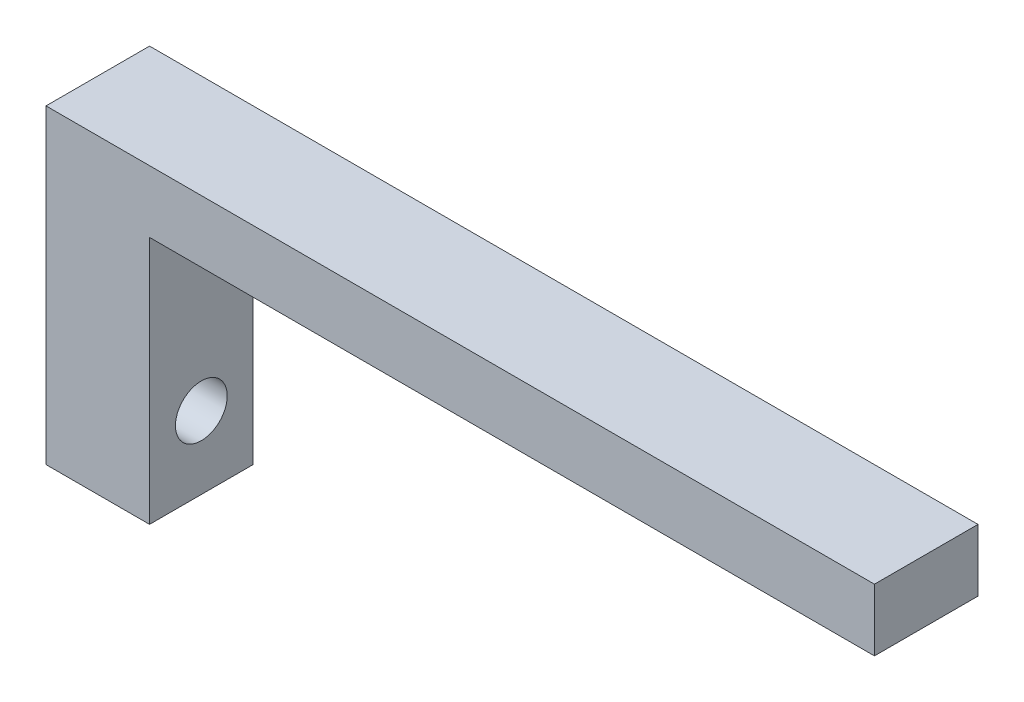
ISO-10303-21;
HEADER;
FILE_DESCRIPTION(('STEP AP214'),'2;1');
FILE_NAME('part.step','',(''),(''),'','','');
FILE_SCHEMA(('AUTOMOTIVE_DESIGN { 1 0 10303 214 1 1 1 1 }'));
ENDSEC;
DATA;
#1=APPLICATION_CONTEXT('core data for automotive mechanical design processes');
#2=APPLICATION_PROTOCOL_DEFINITION('international standard','automotive_design',2000,#1);
#3=PRODUCT_CONTEXT('',#1,'mechanical');
#4=PRODUCT('Part','Part','',(#3));
#5=PRODUCT_RELATED_PRODUCT_CATEGORY('part','',(#4));
#6=PRODUCT_DEFINITION_FORMATION('','',#4);
#7=PRODUCT_DEFINITION_CONTEXT('part definition',#1,'design');
#8=PRODUCT_DEFINITION('design','',#6,#7);
#9=PRODUCT_DEFINITION_SHAPE('','',#8);
#10=(LENGTH_UNIT() NAMED_UNIT(*) SI_UNIT(.MILLI.,.METRE.));
#11=(NAMED_UNIT(*) PLANE_ANGLE_UNIT() SI_UNIT($,.RADIAN.));
#12=(NAMED_UNIT(*) SI_UNIT($,.STERADIAN.) SOLID_ANGLE_UNIT());
#13=UNCERTAINTY_MEASURE_WITH_UNIT(LENGTH_MEASURE(1.E-05),#10,'distance_accuracy_value','');
#14=(GEOMETRIC_REPRESENTATION_CONTEXT(3) GLOBAL_UNCERTAINTY_ASSIGNED_CONTEXT((#13)) GLOBAL_UNIT_ASSIGNED_CONTEXT((#10,
#11,#12)) REPRESENTATION_CONTEXT('',''));
#15=CARTESIAN_POINT('',(0.,0.,0.));
#16=DIRECTION('',(0.,0.,1.));
#17=DIRECTION('',(1.,0.,0.));
#18=AXIS2_PLACEMENT_3D('',#15,#16,#17);
#19=CARTESIAN_POINT('',(40.,4.5,2.5));
#20=DIRECTION('',(-1.,0.,0.));
#21=DIRECTION('',(0.,0.,1.));
#22=AXIS2_PLACEMENT_3D('',#19,#20,#21);
#23=PLANE('',#22);
#24=DIRECTION('',(0.,1.,0.));
#25=VECTOR('',#24,1.);
#26=CARTESIAN_POINT('',(40.,4.5,-2.5));
#27=LINE('',#26,#25);
#28=CARTESIAN_POINT('',(40.,4.5,-2.5));
#29=VERTEX_POINT('',#28);
#30=CARTESIAN_POINT('',(40.,7.5,-2.5));
#31=VERTEX_POINT('',#30);
#32=EDGE_CURVE('E138',#29,#31,#27,.T.);
#33=ORIENTED_EDGE('',*,*,#32,.T.);
#34=DIRECTION('',(0.,0.,-1.));
#35=VECTOR('',#34,1.);
#36=CARTESIAN_POINT('',(40.,7.5,2.5));
#37=LINE('',#36,#35);
#38=CARTESIAN_POINT('',(40.,7.5,2.5));
#39=VERTEX_POINT('',#38);
#40=EDGE_CURVE('E158',#39,#31,#37,.T.);
#41=ORIENTED_EDGE('',*,*,#40,.F.);
#42=DIRECTION('',(0.,1.,0.));
#43=VECTOR('',#42,1.);
#44=CARTESIAN_POINT('',(40.,4.5,2.5));
#45=LINE('',#44,#43);
#46=CARTESIAN_POINT('',(40.,4.5,2.5));
#47=VERTEX_POINT('',#46);
#48=EDGE_CURVE('E150',#47,#39,#45,.T.);
#49=ORIENTED_EDGE('',*,*,#48,.F.);
#50=DIRECTION('',(0.,0.,-1.));
#51=VECTOR('',#50,1.);
#52=CARTESIAN_POINT('',(40.,4.5,2.5));
#53=LINE('',#52,#51);
#54=EDGE_CURVE('E134',#47,#29,#53,.T.);
#55=ORIENTED_EDGE('',*,*,#54,.T.);
#56=EDGE_LOOP('',(#33,#41,#49,#55));
#57=FACE_BOUND('',#56,.T.);
#58=ADVANCED_FACE('F39',(#57),#23,.F.);
#59=CARTESIAN_POINT('',(40.,7.5,2.5));
#60=DIRECTION('',(0.,-1.,0.));
#61=DIRECTION('',(0.,0.,-1.));
#62=AXIS2_PLACEMENT_3D('',#59,#60,#61);
#63=PLANE('',#62);
#64=DIRECTION('',(-1.,0.,0.));
#65=VECTOR('',#64,1.);
#66=CARTESIAN_POINT('',(40.,7.5,-2.5));
#67=LINE('',#66,#65);
#68=CARTESIAN_POINT('',(0.,7.5,-2.5));
#69=VERTEX_POINT('',#68);
#70=EDGE_CURVE('E141',#31,#69,#67,.T.);
#71=ORIENTED_EDGE('',*,*,#70,.T.);
#72=DIRECTION('',(0.,0.,-1.));
#73=VECTOR('',#72,1.);
#74=CARTESIAN_POINT('',(0.,7.5,2.5));
#75=LINE('',#74,#73);
#76=CARTESIAN_POINT('',(0.,7.5,2.5));
#77=VERTEX_POINT('',#76);
#78=EDGE_CURVE('E155',#77,#69,#75,.T.);
#79=ORIENTED_EDGE('',*,*,#78,.F.);
#80=DIRECTION('',(-1.,0.,0.));
#81=VECTOR('',#80,1.);
#82=CARTESIAN_POINT('',(40.,7.5,2.5));
#83=LINE('',#82,#81);
#84=EDGE_CURVE('E97',#39,#77,#83,.T.);
#85=ORIENTED_EDGE('',*,*,#84,.F.);
#86=ORIENTED_EDGE('',*,*,#40,.T.);
#87=EDGE_LOOP('',(#71,#79,#85,#86));
#88=FACE_BOUND('',#87,.T.);
#89=ADVANCED_FACE('F186',(#88),#63,.F.);
#90=CARTESIAN_POINT('',(0.,7.5,2.5));
#91=DIRECTION('',(1.,0.,0.));
#92=DIRECTION('',(0.,1.,0.));
#93=AXIS2_PLACEMENT_3D('',#90,#91,#92);
#94=PLANE('',#93);
#95=CARTESIAN_POINT('',(0.,-4.,0.));
#96=DIRECTION('',(-1.,0.,0.));
#97=DIRECTION('',(0.,0.,1.));
#98=AXIS2_PLACEMENT_3D('',#95,#96,#97);
#99=CIRCLE('',#98,1.24999999999999);
#100=CARTESIAN_POINT('',(0.,-4.,1.24999999999999));
#101=VERTEX_POINT('',#100);
#102=EDGE_CURVE('E229',#101,#101,#99,.T.);
#103=ORIENTED_EDGE('',*,*,#102,.F.);
#104=EDGE_LOOP('',(#103));
#105=FACE_BOUND('',#104,.T.);
#106=CARTESIAN_POINT('',(0.,4.,0.));
#107=DIRECTION('',(-1.,0.,0.));
#108=DIRECTION('',(0.,0.,1.));
#109=AXIS2_PLACEMENT_3D('',#106,#107,#108);
#110=CIRCLE('',#109,1.24999999999999);
#111=CARTESIAN_POINT('',(0.,4.,1.24999999999999));
#112=VERTEX_POINT('',#111);
#113=EDGE_CURVE('E206',#112,#112,#110,.T.);
#114=ORIENTED_EDGE('',*,*,#113,.F.);
#115=EDGE_LOOP('',(#114));
#116=FACE_BOUND('',#115,.T.);
#117=DIRECTION('',(0.,-1.,0.));
#118=VECTOR('',#117,1.);
#119=CARTESIAN_POINT('',(0.,7.5,-2.5));
#120=LINE('',#119,#118);
#121=CARTESIAN_POINT('',(0.,-7.5,-2.5));
#122=VERTEX_POINT('',#121);
#123=EDGE_CURVE('E144',#69,#122,#120,.T.);
#124=ORIENTED_EDGE('',*,*,#123,.T.);
#125=DIRECTION('',(0.,0.,-1.));
#126=VECTOR('',#125,1.);
#127=CARTESIAN_POINT('',(0.,-7.5,2.5));
#128=LINE('',#127,#126);
#129=CARTESIAN_POINT('',(0.,-7.5,2.5));
#130=VERTEX_POINT('',#129);
#131=EDGE_CURVE('E126',#130,#122,#128,.T.);
#132=ORIENTED_EDGE('',*,*,#131,.F.);
#133=DIRECTION('',(0.,-1.,0.));
#134=VECTOR('',#133,1.);
#135=CARTESIAN_POINT('',(0.,7.5,2.5));
#136=LINE('',#135,#134);
#137=EDGE_CURVE('E113',#77,#130,#136,.T.);
#138=ORIENTED_EDGE('',*,*,#137,.F.);
#139=ORIENTED_EDGE('',*,*,#78,.T.);
#140=EDGE_LOOP('',(#124,#132,#138,#139));
#141=FACE_BOUND('',#140,.T.);
#142=ADVANCED_FACE('F184',(#105,#116,#141),#94,.F.);
#143=CARTESIAN_POINT('',(0.,-7.5,2.5));
#144=DIRECTION('',(0.,1.,0.));
#145=DIRECTION('',(0.,0.,1.));
#146=AXIS2_PLACEMENT_3D('',#143,#144,#145);
#147=PLANE('',#146);
#148=DIRECTION('',(1.,0.,0.));
#149=VECTOR('',#148,1.);
#150=CARTESIAN_POINT('',(0.,-7.5,-2.5));
#151=LINE('',#150,#149);
#152=CARTESIAN_POINT('',(5.00000000000001,-7.5,-2.5));
#153=VERTEX_POINT('',#152);
#154=EDGE_CURVE('E122',#122,#153,#151,.T.);
#155=ORIENTED_EDGE('',*,*,#154,.T.);
#156=DIRECTION('',(0.,0.,-1.));
#157=VECTOR('',#156,1.);
#158=CARTESIAN_POINT('',(5.00000000000001,-7.5,2.5));
#159=LINE('',#158,#157);
#160=CARTESIAN_POINT('',(5.00000000000001,-7.5,2.5));
#161=VERTEX_POINT('',#160);
#162=EDGE_CURVE('E119',#161,#153,#159,.T.);
#163=ORIENTED_EDGE('',*,*,#162,.F.);
#164=DIRECTION('',(1.,0.,0.));
#165=VECTOR('',#164,1.);
#166=CARTESIAN_POINT('',(0.,-7.5,2.5));
#167=LINE('',#166,#165);
#168=EDGE_CURVE('E106',#130,#161,#167,.T.);
#169=ORIENTED_EDGE('',*,*,#168,.F.);
#170=ORIENTED_EDGE('',*,*,#131,.T.);
#171=EDGE_LOOP('',(#155,#163,#169,#170));
#172=FACE_BOUND('',#171,.T.);
#173=ADVANCED_FACE('F120',(#172),#147,.F.);
#174=CARTESIAN_POINT('',(5.00000000000001,-7.5,2.5));
#175=DIRECTION('',(-1.,0.,0.));
#176=DIRECTION('',(0.,-1.,0.));
#177=AXIS2_PLACEMENT_3D('',#174,#175,#176);
#178=PLANE('',#177);
#179=CARTESIAN_POINT('',(5.00000000000001,-4.,0.));
#180=DIRECTION('',(-1.,0.,0.));
#181=DIRECTION('',(0.,-1.,0.));
#182=AXIS2_PLACEMENT_3D('',#179,#180,#181);
#183=CIRCLE('',#182,1.24999999999999);
#184=CARTESIAN_POINT('',(5.00000000000001,-5.24999999999999,0.));
#185=VERTEX_POINT('',#184);
#186=EDGE_CURVE('E42',#185,#185,#183,.T.);
#187=ORIENTED_EDGE('',*,*,#186,.T.);
#188=EDGE_LOOP('',(#187));
#189=FACE_BOUND('',#188,.T.);
#190=DIRECTION('',(0.,0.,-1.));
#191=VECTOR('',#190,1.);
#192=CARTESIAN_POINT('',(5.00000000000001,4.5,2.5));
#193=LINE('',#192,#191);
#194=CARTESIAN_POINT('',(5.00000000000001,4.5,-1.14564392373896));
#195=VERTEX_POINT('',#194);
#196=CARTESIAN_POINT('',(5.00000000000001,4.5,-2.5));
#197=VERTEX_POINT('',#196);
#198=EDGE_CURVE('E152',#195,#197,#193,.T.);
#199=ORIENTED_EDGE('',*,*,#198,.F.);
#200=CARTESIAN_POINT('',(5.00000000000001,4.,0.));
#201=DIRECTION('',(-1.,0.,0.));
#202=DIRECTION('',(0.,-1.,0.));
#203=AXIS2_PLACEMENT_3D('',#200,#201,#202);
#204=CIRCLE('',#203,1.24999999999999);
#205=CARTESIAN_POINT('',(5.00000000000001,4.5,1.14564392373895));
#206=VERTEX_POINT('',#205);
#207=EDGE_CURVE('E142',#195,#206,#204,.T.);
#208=ORIENTED_EDGE('',*,*,#207,.T.);
#209=CARTESIAN_POINT('',(5.00000000000001,4.5,2.5));
#210=VERTEX_POINT('',#209);
#211=EDGE_CURVE('E127',#210,#206,#193,.T.);
#212=ORIENTED_EDGE('',*,*,#211,.F.);
#213=DIRECTION('',(0.,1.,0.));
#214=VECTOR('',#213,1.);
#215=CARTESIAN_POINT('',(5.00000000000001,-7.5,2.5));
#216=LINE('',#215,#214);
#217=EDGE_CURVE('E110',#161,#210,#216,.T.);
#218=ORIENTED_EDGE('',*,*,#217,.F.);
#219=ORIENTED_EDGE('',*,*,#162,.T.);
#220=DIRECTION('',(0.,1.,0.));
#221=VECTOR('',#220,1.);
#222=CARTESIAN_POINT('',(5.00000000000001,-7.5,-2.5));
#223=LINE('',#222,#221);
#224=EDGE_CURVE('E147',#153,#197,#223,.T.);
#225=ORIENTED_EDGE('',*,*,#224,.T.);
#226=EDGE_LOOP('',(#199,#208,#212,#218,#219,#225));
#227=FACE_BOUND('',#226,.T.);
#228=ADVANCED_FACE('F130',(#189,#227),#178,.F.);
#229=CARTESIAN_POINT('',(5.00000000000001,4.5,2.5));
#230=DIRECTION('',(0.,1.,0.));
#231=DIRECTION('',(0.,0.,1.));
#232=AXIS2_PLACEMENT_3D('',#229,#230,#231);
#233=PLANE('',#232);
#234=CARTESIAN_POINT('',(10.381869748121,4.5,-6.41999922964765));
#235=CARTESIAN_POINT('',(10.5170002690123,4.5,-6.1944172729891));
#236=CARTESIAN_POINT('',(10.6521041357822,4.5,-5.96881932763075));
#237=CARTESIAN_POINT('',(10.9222266837429,4.5,-5.51756293186006));
#238=CARTESIAN_POINT('',(11.0572453621583,4.5,-5.29190447978652));
#239=CARTESIAN_POINT('',(11.3272645391374,4.5,-4.84033313871578));
#240=CARTESIAN_POINT('',(11.4622649379314,4.5,-4.61442019005475));
#241=CARTESIAN_POINT('',(11.7320697575813,4.5,-4.16248650204858));
#242=CARTESIAN_POINT('',(11.8668741842384,4.5,-3.93646576616852));
#243=CARTESIAN_POINT('',(12.1339816420441,4.5,-3.4879053012385));
#244=CARTESIAN_POINT('',(12.2662897653344,4.5,-3.26536860457789));
#245=CARTESIAN_POINT('',(12.5303866519442,4.5,-2.81996013256541));
#246=CARTESIAN_POINT('',(12.6621753685325,4.5,-2.59708832944827));
#247=CARTESIAN_POINT('',(12.8589857255813,4.5,-2.26234385146687));
#248=CARTESIAN_POINT('',(12.9244270678833,4.5,-2.15071822225319));
#249=CARTESIAN_POINT('',(13.0548654567227,4.5,-1.927202651846));
#250=CARTESIAN_POINT('',(13.1198624884904,4.5,-1.81531270203076));
#251=CARTESIAN_POINT('',(13.2491194303502,4.5,-1.59113004529639));
#252=CARTESIAN_POINT('',(13.3133794590355,4.5,-1.47883740710334));
#253=CARTESIAN_POINT('',(13.4087411959216,4.5,-1.30982155959564));
#254=CARTESIAN_POINT('',(13.4403562274302,4.5,-1.25338830870608));
#255=CARTESIAN_POINT('',(13.5030878228752,4.5,-1.14024575507359));
#256=CARTESIAN_POINT('',(13.5342043965882,4.5,-1.08353645777348));
#257=CARTESIAN_POINT('',(13.5776033634524,4.5,-1.00319499034196));
#258=CARTESIAN_POINT('',(13.5901964162118,4.5,-0.979730721615273));
#259=CARTESIAN_POINT('',(13.6152279003634,4.5,-0.932719783488962));
#260=CARTESIAN_POINT('',(13.6276663308805,4.5,-0.909173113623884));
#261=CARTESIAN_POINT('',(13.6647091710602,4.5,-0.838379607305833));
#262=CARTESIAN_POINT('',(13.6890370367526,4.5,-0.790986806237678));
#263=CARTESIAN_POINT('',(13.736765635044,4.5,-0.695256185628006));
#264=CARTESIAN_POINT('',(13.7601572986399,4.5,-0.646913825872064));
#265=CARTESIAN_POINT('',(13.8051257864966,4.5,-0.549388317203101));
#266=CARTESIAN_POINT('',(13.8267031172208,4.5,-0.500205407569646));
#267=CARTESIAN_POINT('',(13.8584332999774,4.5,-0.421284137649787));
#268=CARTESIAN_POINT('',(13.8696071488271,4.5,-0.391960013884446));
#269=CARTESIAN_POINT('',(13.8904781411142,4.5,-0.33277369569118));
#270=CARTESIAN_POINT('',(13.9001749099649,4.5,-0.302911366914862));
#271=CARTESIAN_POINT('',(13.9174153199109,4.5,-0.242989488319613));
#272=CARTESIAN_POINT('',(13.9249859917776,4.5,-0.212937901259757));
#273=CARTESIAN_POINT('',(13.9374818915006,4.5,-0.152301147771936));
#274=CARTESIAN_POINT('',(13.9424096486757,4.5,-0.121716520527297));
#275=CARTESIAN_POINT('',(13.9490934908084,4.5,-0.0595149405224267));
#276=CARTESIAN_POINT('',(13.950778537461,4.5,-0.0278899789629515));
#277=CARTESIAN_POINT('',(13.950495725213,4.5,0.0353380687082367));
#278=CARTESIAN_POINT('',(13.9485283713036,4.5,0.0669411572398139));
#279=CARTESIAN_POINT('',(13.9412051175253,4.5,0.13013712520526));
#280=CARTESIAN_POINT('',(13.9358069453374,4.5,0.161724885482923));
#281=CARTESIAN_POINT('',(13.9222677933933,4.5,0.224307077431947));
#282=CARTESIAN_POINT('',(13.9141249459818,4.5,0.255301089860671));
#283=CARTESIAN_POINT('',(13.8916734119357,4.5,0.330583843720593));
#284=CARTESIAN_POINT('',(13.8762428989183,4.5,0.374531029296983));
#285=CARTESIAN_POINT('',(13.842753304653,4.5,0.461425816743327));
#286=CARTESIAN_POINT('',(13.8246915132573,4.5,0.504372334400756));
#287=CARTESIAN_POINT('',(13.7868811002953,4.5,0.58962701008412));
#288=CARTESIAN_POINT('',(13.7671286860353,4.5,0.631933468247699));
#289=CARTESIAN_POINT('',(13.7265433691473,4.5,0.716027506673625));
#290=CARTESIAN_POINT('',(13.7057103024799,4.5,0.757815006959624));
#291=CARTESIAN_POINT('',(13.6416960012999,4.5,0.883503486898264));
#292=CARTESIAN_POINT('',(13.5974145201582,4.5,0.966841347033281));
#293=CARTESIAN_POINT('',(13.5074906154217,4.5,1.13256928690077));
#294=CARTESIAN_POINT('',(13.4618508383687,4.5,1.21496082523791));
#295=CARTESIAN_POINT('',(13.369175348453,4.5,1.38026226945779));
#296=CARTESIAN_POINT('',(13.3221294417099,4.5,1.46316645888801));
#297=CARTESIAN_POINT('',(13.2275065367977,4.5,1.6286704745634));
#298=CARTESIAN_POINT('',(13.1799295366032,4.5,1.71127029964628));
#299=CARTESIAN_POINT('',(13.0366802955961,4.5,1.95878008562376));
#300=CARTESIAN_POINT('',(12.9404943010507,4.5,2.12339245437991));
#301=CARTESIAN_POINT('',(12.7473663816317,4.5,2.45237731151354));
#302=CARTESIAN_POINT('',(12.6504238374586,4.5,2.61674943492515));
#303=CARTESIAN_POINT('',(12.4561507000348,4.5,2.94525908659449));
#304=CARTESIAN_POINT('',(12.3588201158308,4.5,3.10939662020164));
#305=CARTESIAN_POINT('',(12.1699354314105,4.5,3.42739732745294));
#306=CARTESIAN_POINT('',(12.0783957591109,4.5,3.58126907902907));
#307=CARTESIAN_POINT('',(11.8951704101294,4.5,3.888927204514));
#308=CARTESIAN_POINT('',(11.8034847323467,4.5,4.04271357776721));
#309=CARTESIAN_POINT('',(11.6201033672602,4.5,4.35007033510532));
#310=CARTESIAN_POINT('',(11.5284077830579,4.5,4.50364078072117));
#311=CARTESIAN_POINT('',(11.3449404228361,4.5,4.81073446553511));
#312=CARTESIAN_POINT('',(11.2531686474406,4.5,4.96425770510597));
#313=CARTESIAN_POINT('',(11.1613710390476,4.5,5.11776548180271));
#314=B_SPLINE_CURVE_WITH_KNOTS('',3,(#234,#235,#236,#237,#238,#239,#240,#241,#242,#243,#244,
#245,#246,#247,#248,#249,#250,#251,#252,#253,#254,#255,#256,#257,#258,#259,#260,#261,#262,#263,
#264,#265,#266,#267,#268,#269,#270,#271,#272,#273,#274,#275,#276,#277,#278,#279,#280,#281,#282,
#283,#284,#285,#286,#287,#288,#289,#290,#291,#292,#293,#294,#295,#296,#297,#298,#299,#300,#301,
#302,#303,#304,#305,#306,#307,#308,#309,#310,#311,#312,#313),.UNSPECIFIED.,.F.,.F.,(4,2,2,2,2,2,
2,2,2,2,2,2,2,2,2,2,2,2,2,2,2,2,2,2,2,2,2,2,2,2,2,2,2,2,2,2,2,2,2,4),(0.,0.788877263086222,
1.57777902126677,2.3673078939505,3.15681289835077,3.93350580262447,4.7102670602357,
5.09844880356966,5.48664338860381,5.87477460612344,6.06882986049429,6.26288130404093,
6.34277076145401,6.42266067086188,6.58246620420982,6.74356169383363,6.90461206399372,
6.99872724214926,7.09286624826717,7.18574776815395,7.27854023935392,7.37334336299406,
7.46813337986218,7.56411459917259,7.66016126263856,7.79974185108545,7.93946723384212,
8.07951472829303,8.21958354405887,8.50266255060174,8.78522208734422,9.07118633633982,
9.35715167622743,9.92910961797265,10.50159896081,11.0740750338071,11.61120087414,
12.1483307834804,12.6849196699594,13.2215042042659),.UNSPECIFIED.);
#315=CARTESIAN_POINT('',(13.5,4.5,1.14564392373896));
#316=VERTEX_POINT('',#315);
#317=CARTESIAN_POINT('',(13.5,4.5,-1.14564392373896));
#318=VERTEX_POINT('',#317);
#319=EDGE_CURVE('E160',#316,#318,#314,.F.);
#320=ORIENTED_EDGE('',*,*,#319,.T.);
#321=DIRECTION('',(-1.,0.,0.));
#322=VECTOR('',#321,1.);
#323=CARTESIAN_POINT('',(0.,4.5,-1.14564392373896));
#324=LINE('',#323,#322);
#325=EDGE_CURVE('E11',#318,#195,#324,.T.);
#326=ORIENTED_EDGE('',*,*,#325,.T.);
#327=ORIENTED_EDGE('',*,*,#198,.T.);
#328=DIRECTION('',(1.,0.,0.));
#329=VECTOR('',#328,1.);
#330=CARTESIAN_POINT('',(5.00000000000001,4.5,-2.5));
#331=LINE('',#330,#329);
#332=EDGE_CURVE('E88',#197,#29,#331,.T.);
#333=ORIENTED_EDGE('',*,*,#332,.T.);
#334=ORIENTED_EDGE('',*,*,#54,.F.);
#335=DIRECTION('',(1.,0.,0.));
#336=VECTOR('',#335,1.);
#337=CARTESIAN_POINT('',(5.00000000000001,4.5,2.5));
#338=LINE('',#337,#336);
#339=EDGE_CURVE('E62',#210,#47,#338,.T.);
#340=ORIENTED_EDGE('',*,*,#339,.F.);
#341=ORIENTED_EDGE('',*,*,#211,.T.);
#342=DIRECTION('',(-1.,0.,0.));
#343=VECTOR('',#342,1.);
#344=CARTESIAN_POINT('',(0.,4.5,1.14564392373895));
#345=LINE('',#344,#343);
#346=EDGE_CURVE('E47',#206,#316,#345,.F.);
#347=ORIENTED_EDGE('',*,*,#346,.T.);
#348=EDGE_LOOP('',(#320,#326,#327,#333,#334,#340,#341,#347));
#349=FACE_BOUND('',#348,.T.);
#350=ADVANCED_FACE('F173',(#349),#233,.F.);
#351=CARTESIAN_POINT('',(0.,0.,2.5));
#352=DIRECTION('',(0.,0.,1.));
#353=DIRECTION('',(1.,0.,0.));
#354=AXIS2_PLACEMENT_3D('',#351,#352,#353);
#355=PLANE('',#354);
#356=ORIENTED_EDGE('',*,*,#48,.T.);
#357=ORIENTED_EDGE('',*,*,#84,.T.);
#358=ORIENTED_EDGE('',*,*,#137,.T.);
#359=ORIENTED_EDGE('',*,*,#168,.T.);
#360=ORIENTED_EDGE('',*,*,#217,.T.);
#361=ORIENTED_EDGE('',*,*,#339,.T.);
#362=EDGE_LOOP('',(#356,#357,#358,#359,#360,#361));
#363=FACE_BOUND('',#362,.T.);
#364=ADVANCED_FACE('F108',(#363),#355,.T.);
#365=CARTESIAN_POINT('',(0.,0.,-2.5));
#366=DIRECTION('',(0.,0.,1.));
#367=DIRECTION('',(1.,0.,0.));
#368=AXIS2_PLACEMENT_3D('',#365,#366,#367);
#369=PLANE('',#368);
#370=ORIENTED_EDGE('',*,*,#32,.F.);
#371=ORIENTED_EDGE('',*,*,#332,.F.);
#372=ORIENTED_EDGE('',*,*,#224,.F.);
#373=ORIENTED_EDGE('',*,*,#154,.F.);
#374=ORIENTED_EDGE('',*,*,#123,.F.);
#375=ORIENTED_EDGE('',*,*,#70,.F.);
#376=EDGE_LOOP('',(#370,#371,#372,#373,#374,#375));
#377=FACE_BOUND('',#376,.T.);
#378=ADVANCED_FACE('F178',(#377),#369,.F.);
#379=CARTESIAN_POINT('',(0.,4.,0.));
#380=DIRECTION('',(-1.,0.,0.));
#381=DIRECTION('',(0.,0.,1.));
#382=AXIS2_PLACEMENT_3D('',#379,#380,#381);
#383=CYLINDRICAL_SURFACE('',#382,1.24999999999999);
#384=ORIENTED_EDGE('',*,*,#113,.T.);
#385=EDGE_LOOP('',(#384));
#386=FACE_BOUND('',#385,.T.);
#387=CARTESIAN_POINT('',(13.5,4.,0.));
#388=DIRECTION('',(-1.,0.,0.));
#389=DIRECTION('',(0.,0.,1.));
#390=AXIS2_PLACEMENT_3D('',#387,#388,#389);
#391=CIRCLE('',#390,1.25);
#392=EDGE_CURVE('E53',#316,#318,#391,.T.);
#393=ORIENTED_EDGE('',*,*,#392,.F.);
#394=ORIENTED_EDGE('',*,*,#346,.F.);
#395=ORIENTED_EDGE('',*,*,#207,.F.);
#396=ORIENTED_EDGE('',*,*,#325,.F.);
#397=EDGE_LOOP('',(#393,#394,#395,#396));
#398=FACE_BOUND('',#397,.T.);
#399=ADVANCED_FACE('F202',(#386,#398),#383,.F.);
#400=CARTESIAN_POINT('',(13.5,4.,0.));
#401=DIRECTION('',(-1.,0.,0.));
#402=DIRECTION('',(0.,0.,1.));
#403=AXIS2_PLACEMENT_3D('',#400,#401,#402);
#404=CONICAL_SURFACE('',#403,1.25,1.02974425867665);
#405=ORIENTED_EDGE('',*,*,#392,.T.);
#406=ORIENTED_EDGE('',*,*,#319,.F.);
#407=EDGE_LOOP('',(#405,#406));
#408=FACE_BOUND('',#407,.T.);
#409=ADVANCED_FACE('F169',(#408),#404,.F.);
#410=CARTESIAN_POINT('',(0.,-4.,0.));
#411=DIRECTION('',(-1.,0.,0.));
#412=DIRECTION('',(0.,0.,1.));
#413=AXIS2_PLACEMENT_3D('',#410,#411,#412);
#414=CYLINDRICAL_SURFACE('',#413,1.24999999999999);
#415=ORIENTED_EDGE('',*,*,#102,.T.);
#416=EDGE_LOOP('',(#415));
#417=FACE_BOUND('',#416,.T.);
#418=ORIENTED_EDGE('',*,*,#186,.F.);
#419=EDGE_LOOP('',(#418));
#420=FACE_BOUND('',#419,.T.);
#421=ADVANCED_FACE('F214',(#417,#420),#414,.F.);
#422=CLOSED_SHELL('',(#58,#89,#142,#173,#228,#350,#364,#378,#399,#409,#421));
#423=MANIFOLD_SOLID_BREP('B2',#422);
#424=ADVANCED_BREP_SHAPE_REPRESENTATION('',(#18,#423),#14);
#425=SHAPE_DEFINITION_REPRESENTATION(#9,#424);
ENDSEC;
END-ISO-10303-21;
